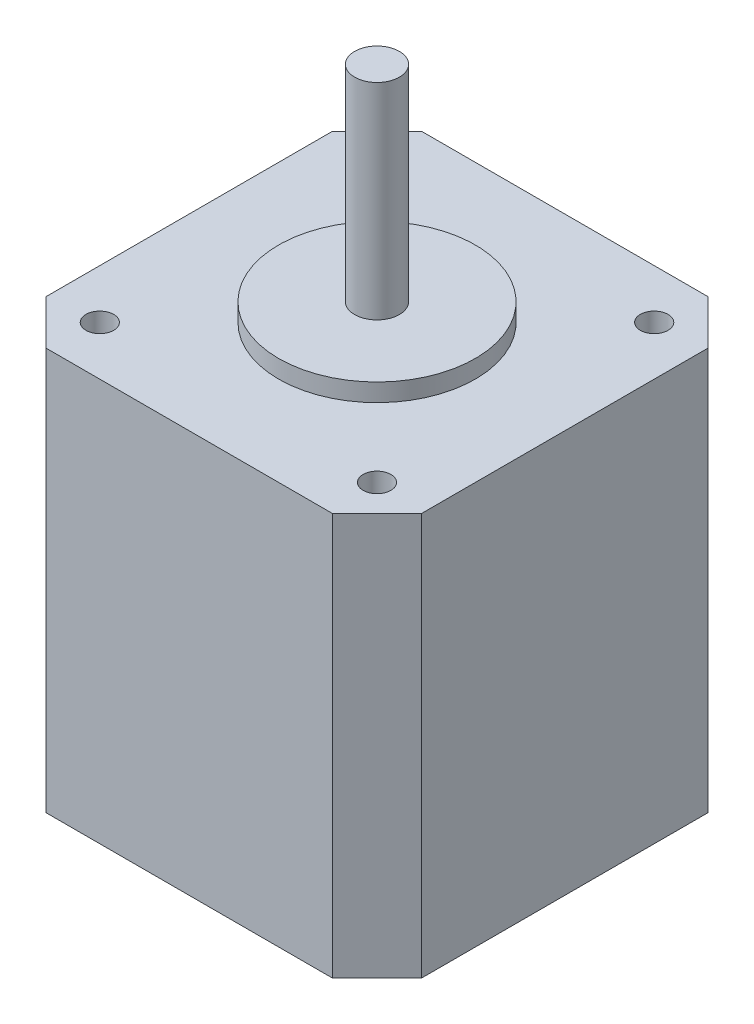
ISO-10303-21;
HEADER;
FILE_DESCRIPTION(('STEP AP214'),'2;1');
FILE_NAME('part.step','',(''),(''),'','','');
FILE_SCHEMA(('AUTOMOTIVE_DESIGN { 1 0 10303 214 1 1 1 1 }'));
ENDSEC;
DATA;
#1=APPLICATION_CONTEXT('core data for automotive mechanical design processes');
#2=APPLICATION_PROTOCOL_DEFINITION('international standard','automotive_design',2000,#1);
#3=PRODUCT_CONTEXT('',#1,'mechanical');
#4=PRODUCT('Part','Part','',(#3));
#5=PRODUCT_RELATED_PRODUCT_CATEGORY('part','',(#4));
#6=PRODUCT_DEFINITION_FORMATION('','',#4);
#7=PRODUCT_DEFINITION_CONTEXT('part definition',#1,'design');
#8=PRODUCT_DEFINITION('design','',#6,#7);
#9=PRODUCT_DEFINITION_SHAPE('','',#8);
#10=(LENGTH_UNIT() NAMED_UNIT(*) SI_UNIT(.MILLI.,.METRE.));
#11=(NAMED_UNIT(*) PLANE_ANGLE_UNIT() SI_UNIT($,.RADIAN.));
#12=(NAMED_UNIT(*) SI_UNIT($,.STERADIAN.) SOLID_ANGLE_UNIT());
#13=UNCERTAINTY_MEASURE_WITH_UNIT(LENGTH_MEASURE(1.E-05),#10,'distance_accuracy_value','');
#14=(GEOMETRIC_REPRESENTATION_CONTEXT(3) GLOBAL_UNCERTAINTY_ASSIGNED_CONTEXT((#13)) GLOBAL_UNIT_ASSIGNED_CONTEXT((#10,
#11,#12)) REPRESENTATION_CONTEXT('',''));
#15=CARTESIAN_POINT('',(0.,0.,0.));
#16=DIRECTION('',(0.,0.,1.));
#17=DIRECTION('',(1.,0.,0.));
#18=AXIS2_PLACEMENT_3D('',#15,#16,#17);
#19=CARTESIAN_POINT('',(-21.,45.,-16.));
#20=DIRECTION('',(1.,0.,0.));
#21=DIRECTION('',(0.,0.,-1.));
#22=AXIS2_PLACEMENT_3D('',#19,#20,#21);
#23=PLANE('',#22);
#24=DIRECTION('',(0.,0.,1.));
#25=VECTOR('',#24,1.);
#26=CARTESIAN_POINT('',(-21.,0.,-16.));
#27=LINE('',#26,#25);
#28=CARTESIAN_POINT('',(-21.,0.,-16.));
#29=VERTEX_POINT('',#28);
#30=CARTESIAN_POINT('',(-21.,0.,16.));
#31=VERTEX_POINT('',#30);
#32=EDGE_CURVE('E135',#29,#31,#27,.T.);
#33=ORIENTED_EDGE('',*,*,#32,.T.);
#34=DIRECTION('',(0.,-1.,0.));
#35=VECTOR('',#34,1.);
#36=CARTESIAN_POINT('',(-21.,45.,16.));
#37=LINE('',#36,#35);
#38=CARTESIAN_POINT('',(-21.,45.,16.));
#39=VERTEX_POINT('',#38);
#40=EDGE_CURVE('E39',#39,#31,#37,.T.);
#41=ORIENTED_EDGE('',*,*,#40,.F.);
#42=DIRECTION('',(0.,0.,1.));
#43=VECTOR('',#42,1.);
#44=CARTESIAN_POINT('',(-21.,45.,-16.));
#45=LINE('',#44,#43);
#46=CARTESIAN_POINT('',(-21.,45.,-16.));
#47=VERTEX_POINT('',#46);
#48=EDGE_CURVE('E150',#47,#39,#45,.T.);
#49=ORIENTED_EDGE('',*,*,#48,.F.);
#50=DIRECTION('',(0.,-1.,0.));
#51=VECTOR('',#50,1.);
#52=CARTESIAN_POINT('',(-21.,45.,-16.));
#53=LINE('',#52,#51);
#54=EDGE_CURVE('E131',#47,#29,#53,.T.);
#55=ORIENTED_EDGE('',*,*,#54,.T.);
#56=EDGE_LOOP('',(#33,#41,#49,#55));
#57=FACE_BOUND('',#56,.T.);
#58=ADVANCED_FACE('F36',(#57),#23,.F.);
#59=CARTESIAN_POINT('',(-21.,45.,16.));
#60=DIRECTION('',(0.707106781186547,0.,-0.707106781186547));
#61=DIRECTION('',(-0.707106781186548,0.,-0.707106781186548));
#62=AXIS2_PLACEMENT_3D('',#59,#60,#61);
#63=PLANE('',#62);
#64=DIRECTION('',(0.707106781186548,0.,0.707106781186548));
#65=VECTOR('',#64,1.);
#66=CARTESIAN_POINT('',(-21.,0.,16.));
#67=LINE('',#66,#65);
#68=CARTESIAN_POINT('',(-16.,0.,21.));
#69=VERTEX_POINT('',#68);
#70=EDGE_CURVE('E138',#31,#69,#67,.T.);
#71=ORIENTED_EDGE('',*,*,#70,.T.);
#72=DIRECTION('',(0.,-1.,0.));
#73=VECTOR('',#72,1.);
#74=CARTESIAN_POINT('',(-16.,45.,21.));
#75=LINE('',#74,#73);
#76=CARTESIAN_POINT('',(-16.,45.,21.));
#77=VERTEX_POINT('',#76);
#78=EDGE_CURVE('E159',#77,#69,#75,.T.);
#79=ORIENTED_EDGE('',*,*,#78,.F.);
#80=DIRECTION('',(0.707106781186548,0.,0.707106781186548));
#81=VECTOR('',#80,1.);
#82=CARTESIAN_POINT('',(-21.,45.,16.));
#83=LINE('',#82,#81);
#84=EDGE_CURVE('E98',#39,#77,#83,.T.);
#85=ORIENTED_EDGE('',*,*,#84,.F.);
#86=ORIENTED_EDGE('',*,*,#40,.T.);
#87=EDGE_LOOP('',(#71,#79,#85,#86));
#88=FACE_BOUND('',#87,.T.);
#89=ADVANCED_FACE('F202',(#88),#63,.F.);
#90=CARTESIAN_POINT('',(-16.,45.,21.));
#91=DIRECTION('',(0.,0.,-1.));
#92=DIRECTION('',(-1.,0.,0.));
#93=AXIS2_PLACEMENT_3D('',#90,#91,#92);
#94=PLANE('',#93);
#95=DIRECTION('',(1.,0.,0.));
#96=VECTOR('',#95,1.);
#97=CARTESIAN_POINT('',(-16.,0.,21.));
#98=LINE('',#97,#96);
#99=CARTESIAN_POINT('',(16.,0.,21.));
#100=VERTEX_POINT('',#99);
#101=EDGE_CURVE('E141',#69,#100,#98,.T.);
#102=ORIENTED_EDGE('',*,*,#101,.T.);
#103=DIRECTION('',(0.,-1.,0.));
#104=VECTOR('',#103,1.);
#105=CARTESIAN_POINT('',(16.,45.,21.));
#106=LINE('',#105,#104);
#107=CARTESIAN_POINT('',(16.,45.,21.));
#108=VERTEX_POINT('',#107);
#109=EDGE_CURVE('E157',#108,#100,#106,.T.);
#110=ORIENTED_EDGE('',*,*,#109,.F.);
#111=DIRECTION('',(1.,0.,0.));
#112=VECTOR('',#111,1.);
#113=CARTESIAN_POINT('',(-16.,45.,21.));
#114=LINE('',#113,#112);
#115=EDGE_CURVE('E173',#77,#108,#114,.T.);
#116=ORIENTED_EDGE('',*,*,#115,.F.);
#117=ORIENTED_EDGE('',*,*,#78,.T.);
#118=EDGE_LOOP('',(#102,#110,#116,#117));
#119=FACE_BOUND('',#118,.T.);
#120=ADVANCED_FACE('F206',(#119),#94,.F.);
#121=CARTESIAN_POINT('',(21.,45.,16.));
#122=DIRECTION('',(-0.707106781186548,0.,-0.707106781186547));
#123=DIRECTION('',(-0.707106781186547,0.,0.707106781186548));
#124=AXIS2_PLACEMENT_3D('',#121,#122,#123);
#125=PLANE('',#124);
#126=DIRECTION('',(0.707106781186547,0.,-0.707106781186548));
#127=VECTOR('',#126,1.);
#128=CARTESIAN_POINT('',(21.,0.,16.));
#129=LINE('',#128,#127);
#130=CARTESIAN_POINT('',(21.,0.,16.));
#131=VERTEX_POINT('',#130);
#132=EDGE_CURVE('E143',#100,#131,#129,.T.);
#133=ORIENTED_EDGE('',*,*,#132,.T.);
#134=DIRECTION('',(0.,-1.,0.));
#135=VECTOR('',#134,1.);
#136=CARTESIAN_POINT('',(21.,45.,16.));
#137=LINE('',#136,#135);
#138=CARTESIAN_POINT('',(21.,45.,16.));
#139=VERTEX_POINT('',#138);
#140=EDGE_CURVE('E154',#139,#131,#137,.T.);
#141=ORIENTED_EDGE('',*,*,#140,.F.);
#142=DIRECTION('',(0.707106781186547,0.,-0.707106781186548));
#143=VECTOR('',#142,1.);
#144=CARTESIAN_POINT('',(21.,45.,16.));
#145=LINE('',#144,#143);
#146=EDGE_CURVE('E175',#108,#139,#145,.T.);
#147=ORIENTED_EDGE('',*,*,#146,.F.);
#148=ORIENTED_EDGE('',*,*,#109,.T.);
#149=EDGE_LOOP('',(#133,#141,#147,#148));
#150=FACE_BOUND('',#149,.T.);
#151=ADVANCED_FACE('F180',(#150),#125,.F.);
#152=CARTESIAN_POINT('',(21.,45.,-16.));
#153=DIRECTION('',(-1.,0.,0.));
#154=DIRECTION('',(0.,0.,1.));
#155=AXIS2_PLACEMENT_3D('',#152,#153,#154);
#156=PLANE('',#155);
#157=DIRECTION('',(0.,0.,-1.));
#158=VECTOR('',#157,1.);
#159=CARTESIAN_POINT('',(21.,0.,-16.));
#160=LINE('',#159,#158);
#161=CARTESIAN_POINT('',(21.,0.,-16.));
#162=VERTEX_POINT('',#161);
#163=EDGE_CURVE('E145',#131,#162,#160,.T.);
#164=ORIENTED_EDGE('',*,*,#163,.T.);
#165=DIRECTION('',(0.,-1.,0.));
#166=VECTOR('',#165,1.);
#167=CARTESIAN_POINT('',(21.,45.,-16.));
#168=LINE('',#167,#166);
#169=CARTESIAN_POINT('',(21.,45.,-16.));
#170=VERTEX_POINT('',#169);
#171=EDGE_CURVE('E126',#170,#162,#168,.T.);
#172=ORIENTED_EDGE('',*,*,#171,.F.);
#173=DIRECTION('',(0.,0.,-1.));
#174=VECTOR('',#173,1.);
#175=CARTESIAN_POINT('',(21.,45.,-16.));
#176=LINE('',#175,#174);
#177=EDGE_CURVE('E117',#139,#170,#176,.T.);
#178=ORIENTED_EDGE('',*,*,#177,.F.);
#179=ORIENTED_EDGE('',*,*,#140,.T.);
#180=EDGE_LOOP('',(#164,#172,#178,#179));
#181=FACE_BOUND('',#180,.T.);
#182=ADVANCED_FACE('F184',(#181),#156,.F.);
#183=CARTESIAN_POINT('',(16.,45.,-21.));
#184=DIRECTION('',(-0.707106781186547,0.,0.707106781186547));
#185=DIRECTION('',(0.707106781186548,0.,0.707106781186548));
#186=AXIS2_PLACEMENT_3D('',#183,#184,#185);
#187=PLANE('',#186);
#188=DIRECTION('',(-0.707106781186548,0.,-0.707106781186548));
#189=VECTOR('',#188,1.);
#190=CARTESIAN_POINT('',(16.,0.,-21.));
#191=LINE('',#190,#189);
#192=CARTESIAN_POINT('',(16.,0.,-21.));
#193=VERTEX_POINT('',#192);
#194=EDGE_CURVE('E125',#162,#193,#191,.T.);
#195=ORIENTED_EDGE('',*,*,#194,.T.);
#196=DIRECTION('',(0.,-1.,0.));
#197=VECTOR('',#196,1.);
#198=CARTESIAN_POINT('',(16.,45.,-21.));
#199=LINE('',#198,#197);
#200=CARTESIAN_POINT('',(16.,45.,-21.));
#201=VERTEX_POINT('',#200);
#202=EDGE_CURVE('E122',#201,#193,#199,.T.);
#203=ORIENTED_EDGE('',*,*,#202,.F.);
#204=DIRECTION('',(-0.707106781186548,0.,-0.707106781186548));
#205=VECTOR('',#204,1.);
#206=CARTESIAN_POINT('',(16.,45.,-21.));
#207=LINE('',#206,#205);
#208=EDGE_CURVE('E111',#170,#201,#207,.T.);
#209=ORIENTED_EDGE('',*,*,#208,.F.);
#210=ORIENTED_EDGE('',*,*,#171,.T.);
#211=EDGE_LOOP('',(#195,#203,#209,#210));
#212=FACE_BOUND('',#211,.T.);
#213=ADVANCED_FACE('F123',(#212),#187,.F.);
#214=CARTESIAN_POINT('',(-16.,45.,-21.));
#215=DIRECTION('',(0.,0.,1.));
#216=DIRECTION('',(1.,0.,0.));
#217=AXIS2_PLACEMENT_3D('',#214,#215,#216);
#218=PLANE('',#217);
#219=DIRECTION('',(-1.,0.,0.));
#220=VECTOR('',#219,1.);
#221=CARTESIAN_POINT('',(-16.,0.,-21.));
#222=LINE('',#221,#220);
#223=CARTESIAN_POINT('',(-16.,0.,-21.));
#224=VERTEX_POINT('',#223);
#225=EDGE_CURVE('E83',#193,#224,#222,.T.);
#226=ORIENTED_EDGE('',*,*,#225,.T.);
#227=DIRECTION('',(0.,-1.,0.));
#228=VECTOR('',#227,1.);
#229=CARTESIAN_POINT('',(-16.,45.,-21.));
#230=LINE('',#229,#228);
#231=CARTESIAN_POINT('',(-16.,45.,-21.));
#232=VERTEX_POINT('',#231);
#233=EDGE_CURVE('E127',#232,#224,#230,.T.);
#234=ORIENTED_EDGE('',*,*,#233,.F.);
#235=DIRECTION('',(-1.,0.,0.));
#236=VECTOR('',#235,1.);
#237=CARTESIAN_POINT('',(-16.,45.,-21.));
#238=LINE('',#237,#236);
#239=EDGE_CURVE('E115',#201,#232,#238,.T.);
#240=ORIENTED_EDGE('',*,*,#239,.F.);
#241=ORIENTED_EDGE('',*,*,#202,.T.);
#242=EDGE_LOOP('',(#226,#234,#240,#241));
#243=FACE_BOUND('',#242,.T.);
#244=ADVANCED_FACE('F129',(#243),#218,.F.);
#245=CARTESIAN_POINT('',(-16.,45.,-21.));
#246=DIRECTION('',(0.707106781186548,0.,0.707106781186547));
#247=DIRECTION('',(0.707106781186547,0.,-0.707106781186548));
#248=AXIS2_PLACEMENT_3D('',#245,#246,#247);
#249=PLANE('',#248);
#250=DIRECTION('',(-0.707106781186547,0.,0.707106781186548));
#251=VECTOR('',#250,1.);
#252=CARTESIAN_POINT('',(-16.,0.,-21.));
#253=LINE('',#252,#251);
#254=EDGE_CURVE('E89',#224,#29,#253,.T.);
#255=ORIENTED_EDGE('',*,*,#254,.T.);
#256=ORIENTED_EDGE('',*,*,#54,.F.);
#257=DIRECTION('',(-0.707106781186547,0.,0.707106781186548));
#258=VECTOR('',#257,1.);
#259=CARTESIAN_POINT('',(-16.,45.,-21.));
#260=LINE('',#259,#258);
#261=EDGE_CURVE('E54',#232,#47,#260,.T.);
#262=ORIENTED_EDGE('',*,*,#261,.F.);
#263=ORIENTED_EDGE('',*,*,#233,.T.);
#264=EDGE_LOOP('',(#255,#256,#262,#263));
#265=FACE_BOUND('',#264,.T.);
#266=ADVANCED_FACE('F190',(#265),#249,.F.);
#267=CARTESIAN_POINT('',(0.,45.,0.));
#268=DIRECTION('',(0.,1.,0.));
#269=DIRECTION('',(0.,0.,1.));
#270=AXIS2_PLACEMENT_3D('',#267,#268,#269);
#271=PLANE('',#270);
#272=CARTESIAN_POINT('',(15.5,45.,-15.5));
#273=DIRECTION('',(0.,1.,0.));
#274=DIRECTION('',(0.,0.,1.));
#275=AXIS2_PLACEMENT_3D('',#272,#273,#274);
#276=CIRCLE('',#275,1.55);
#277=CARTESIAN_POINT('',(15.5,45.,-13.95));
#278=VERTEX_POINT('',#277);
#279=EDGE_CURVE('E370',#278,#278,#276,.T.);
#280=ORIENTED_EDGE('',*,*,#279,.F.);
#281=EDGE_LOOP('',(#280));
#282=FACE_BOUND('',#281,.T.);
#283=CARTESIAN_POINT('',(-15.5,45.,15.5));
#284=DIRECTION('',(0.,1.,0.));
#285=DIRECTION('',(0.,0.,1.));
#286=AXIS2_PLACEMENT_3D('',#283,#284,#285);
#287=CIRCLE('',#286,1.55);
#288=CARTESIAN_POINT('',(-15.5,45.,17.05));
#289=VERTEX_POINT('',#288);
#290=EDGE_CURVE('E384',#289,#289,#287,.T.);
#291=ORIENTED_EDGE('',*,*,#290,.F.);
#292=EDGE_LOOP('',(#291));
#293=FACE_BOUND('',#292,.T.);
#294=CARTESIAN_POINT('',(15.5,45.,15.5));
#295=DIRECTION('',(0.,1.,0.));
#296=DIRECTION('',(0.,0.,1.));
#297=AXIS2_PLACEMENT_3D('',#294,#295,#296);
#298=CIRCLE('',#297,1.55);
#299=CARTESIAN_POINT('',(15.5,45.,17.05));
#300=VERTEX_POINT('',#299);
#301=EDGE_CURVE('E379',#300,#300,#298,.T.);
#302=ORIENTED_EDGE('',*,*,#301,.F.);
#303=EDGE_LOOP('',(#302));
#304=FACE_BOUND('',#303,.T.);
#305=CARTESIAN_POINT('',(-15.5,45.,-15.5));
#306=DIRECTION('',(0.,1.,0.));
#307=DIRECTION('',(0.,0.,1.));
#308=AXIS2_PLACEMENT_3D('',#305,#306,#307);
#309=CIRCLE('',#308,1.55);
#310=CARTESIAN_POINT('',(-15.5,45.,-13.95));
#311=VERTEX_POINT('',#310);
#312=EDGE_CURVE('E369',#311,#311,#309,.T.);
#313=ORIENTED_EDGE('',*,*,#312,.F.);
#314=EDGE_LOOP('',(#313));
#315=FACE_BOUND('',#314,.T.);
#316=CARTESIAN_POINT('',(0.,45.,0.));
#317=DIRECTION('',(0.,1.,0.));
#318=DIRECTION('',(0.,0.,1.));
#319=AXIS2_PLACEMENT_3D('',#316,#317,#318);
#320=CIRCLE('',#319,11.);
#321=CARTESIAN_POINT('',(0.,45.,11.));
#322=VERTEX_POINT('',#321);
#323=EDGE_CURVE('E45',#322,#322,#320,.T.);
#324=ORIENTED_EDGE('',*,*,#323,.F.);
#325=EDGE_LOOP('',(#324));
#326=FACE_BOUND('',#325,.T.);
#327=ORIENTED_EDGE('',*,*,#48,.T.);
#328=ORIENTED_EDGE('',*,*,#84,.T.);
#329=ORIENTED_EDGE('',*,*,#115,.T.);
#330=ORIENTED_EDGE('',*,*,#146,.T.);
#331=ORIENTED_EDGE('',*,*,#177,.T.);
#332=ORIENTED_EDGE('',*,*,#208,.T.);
#333=ORIENTED_EDGE('',*,*,#239,.T.);
#334=ORIENTED_EDGE('',*,*,#261,.T.);
#335=EDGE_LOOP('',(#327,#328,#329,#330,#331,#332,#333,#334));
#336=FACE_BOUND('',#335,.T.);
#337=ADVANCED_FACE('F113',(#282,#293,#304,#315,#326,#336),#271,.T.);
#338=CARTESIAN_POINT('',(0.,0.,0.));
#339=DIRECTION('',(0.,1.,0.));
#340=DIRECTION('',(0.,0.,1.));
#341=AXIS2_PLACEMENT_3D('',#338,#339,#340);
#342=PLANE('',#341);
#343=ORIENTED_EDGE('',*,*,#32,.F.);
#344=ORIENTED_EDGE('',*,*,#254,.F.);
#345=ORIENTED_EDGE('',*,*,#225,.F.);
#346=ORIENTED_EDGE('',*,*,#194,.F.);
#347=ORIENTED_EDGE('',*,*,#163,.F.);
#348=ORIENTED_EDGE('',*,*,#132,.F.);
#349=ORIENTED_EDGE('',*,*,#101,.F.);
#350=ORIENTED_EDGE('',*,*,#70,.F.);
#351=EDGE_LOOP('',(#343,#344,#345,#346,#347,#348,#349,#350));
#352=FACE_BOUND('',#351,.T.);
#353=ADVANCED_FACE('F187',(#352),#342,.F.);
#354=CARTESIAN_POINT('',(0.,47.,0.));
#355=DIRECTION('',(0.,-1.,0.));
#356=DIRECTION('',(0.,0.,-1.));
#357=AXIS2_PLACEMENT_3D('',#354,#355,#356);
#358=CYLINDRICAL_SURFACE('',#357,11.);
#359=CARTESIAN_POINT('',(0.,47.,0.));
#360=DIRECTION('',(0.,1.,0.));
#361=DIRECTION('',(0.,0.,1.));
#362=AXIS2_PLACEMENT_3D('',#359,#360,#361);
#363=CIRCLE('',#362,11.);
#364=CARTESIAN_POINT('',(0.,47.,11.));
#365=VERTEX_POINT('',#364);
#366=EDGE_CURVE('E139',#365,#365,#363,.T.);
#367=ORIENTED_EDGE('',*,*,#366,.F.);
#368=EDGE_LOOP('',(#367));
#369=FACE_BOUND('',#368,.T.);
#370=ORIENTED_EDGE('',*,*,#323,.T.);
#371=EDGE_LOOP('',(#370));
#372=FACE_BOUND('',#371,.T.);
#373=ADVANCED_FACE('F239',(#369,#372),#358,.T.);
#374=CARTESIAN_POINT('',(0.,47.,0.));
#375=DIRECTION('',(0.,1.,0.));
#376=DIRECTION('',(0.,0.,1.));
#377=AXIS2_PLACEMENT_3D('',#374,#375,#376);
#378=PLANE('',#377);
#379=CARTESIAN_POINT('',(0.,47.,0.));
#380=DIRECTION('',(0.,1.,0.));
#381=DIRECTION('',(0.,0.,1.));
#382=AXIS2_PLACEMENT_3D('',#379,#380,#381);
#383=CIRCLE('',#382,2.5);
#384=CARTESIAN_POINT('',(0.,47.,2.5));
#385=VERTEX_POINT('',#384);
#386=EDGE_CURVE('E11',#385,#385,#383,.T.);
#387=ORIENTED_EDGE('',*,*,#386,.F.);
#388=EDGE_LOOP('',(#387));
#389=FACE_BOUND('',#388,.T.);
#390=ORIENTED_EDGE('',*,*,#366,.T.);
#391=EDGE_LOOP('',(#390));
#392=FACE_BOUND('',#391,.T.);
#393=ADVANCED_FACE('F247',(#389,#392),#378,.T.);
#394=CARTESIAN_POINT('',(0.,70.,0.));
#395=DIRECTION('',(0.,-1.,0.));
#396=DIRECTION('',(0.,0.,-1.));
#397=AXIS2_PLACEMENT_3D('',#394,#395,#396);
#398=CYLINDRICAL_SURFACE('',#397,2.5);
#399=CARTESIAN_POINT('',(0.,70.,0.));
#400=DIRECTION('',(0.,1.,0.));
#401=DIRECTION('',(0.,0.,1.));
#402=AXIS2_PLACEMENT_3D('',#399,#400,#401);
#403=CIRCLE('',#402,2.5);
#404=CARTESIAN_POINT('',(0.,70.,2.5));
#405=VERTEX_POINT('',#404);
#406=EDGE_CURVE('E389',#405,#405,#403,.T.);
#407=ORIENTED_EDGE('',*,*,#406,.F.);
#408=EDGE_LOOP('',(#407));
#409=FACE_BOUND('',#408,.T.);
#410=ORIENTED_EDGE('',*,*,#386,.T.);
#411=EDGE_LOOP('',(#410));
#412=FACE_BOUND('',#411,.T.);
#413=ADVANCED_FACE('F257',(#409,#412),#398,.T.);
#414=CARTESIAN_POINT('',(0.,70.,0.));
#415=DIRECTION('',(0.,1.,0.));
#416=DIRECTION('',(0.,0.,1.));
#417=AXIS2_PLACEMENT_3D('',#414,#415,#416);
#418=PLANE('',#417);
#419=ORIENTED_EDGE('',*,*,#406,.T.);
#420=EDGE_LOOP('',(#419));
#421=FACE_BOUND('',#420,.T.);
#422=ADVANCED_FACE('F267',(#421),#418,.T.);
#423=CARTESIAN_POINT('',(-15.5,40.,-15.5));
#424=DIRECTION('',(0.,1.,0.));
#425=DIRECTION('',(0.,0.,1.));
#426=AXIS2_PLACEMENT_3D('',#423,#424,#425);
#427=CYLINDRICAL_SURFACE('',#426,1.55);
#428=CARTESIAN_POINT('',(-15.5,40.,-15.5));
#429=DIRECTION('',(0.,1.,0.));
#430=DIRECTION('',(0.,0.,1.));
#431=AXIS2_PLACEMENT_3D('',#428,#429,#430);
#432=CIRCLE('',#431,1.55);
#433=CARTESIAN_POINT('',(-15.5,40.,-13.95));
#434=VERTEX_POINT('',#433);
#435=EDGE_CURVE('E373',#434,#434,#432,.T.);
#436=ORIENTED_EDGE('',*,*,#435,.F.);
#437=EDGE_LOOP('',(#436));
#438=FACE_BOUND('',#437,.T.);
#439=ORIENTED_EDGE('',*,*,#312,.T.);
#440=EDGE_LOOP('',(#439));
#441=FACE_BOUND('',#440,.T.);
#442=ADVANCED_FACE('F277',(#438,#441),#427,.F.);
#443=CARTESIAN_POINT('',(-15.5,40.,-15.5));
#444=DIRECTION('',(0.,1.,0.));
#445=DIRECTION('',(0.,0.,1.));
#446=AXIS2_PLACEMENT_3D('',#443,#444,#445);
#447=PLANE('',#446);
#448=ORIENTED_EDGE('',*,*,#435,.T.);
#449=EDGE_LOOP('',(#448));
#450=FACE_BOUND('',#449,.T.);
#451=ADVANCED_FACE('F292',(#450),#447,.T.);
#452=CARTESIAN_POINT('',(15.5,40.,15.5));
#453=DIRECTION('',(0.,1.,0.));
#454=DIRECTION('',(0.,0.,1.));
#455=AXIS2_PLACEMENT_3D('',#452,#453,#454);
#456=CYLINDRICAL_SURFACE('',#455,1.55);
#457=CARTESIAN_POINT('',(15.5,40.,15.5));
#458=DIRECTION('',(0.,1.,0.));
#459=DIRECTION('',(0.,0.,1.));
#460=AXIS2_PLACEMENT_3D('',#457,#458,#459);
#461=CIRCLE('',#460,1.55);
#462=CARTESIAN_POINT('',(15.5,40.,17.05));
#463=VERTEX_POINT('',#462);
#464=EDGE_CURVE('E387',#463,#463,#461,.T.);
#465=ORIENTED_EDGE('',*,*,#464,.F.);
#466=EDGE_LOOP('',(#465));
#467=FACE_BOUND('',#466,.T.);
#468=ORIENTED_EDGE('',*,*,#301,.T.);
#469=EDGE_LOOP('',(#468));
#470=FACE_BOUND('',#469,.T.);
#471=ADVANCED_FACE('F302',(#467,#470),#456,.F.);
#472=CARTESIAN_POINT('',(15.5,40.,15.5));
#473=DIRECTION('',(0.,1.,0.));
#474=DIRECTION('',(0.,0.,1.));
#475=AXIS2_PLACEMENT_3D('',#472,#473,#474);
#476=PLANE('',#475);
#477=ORIENTED_EDGE('',*,*,#464,.T.);
#478=EDGE_LOOP('',(#477));
#479=FACE_BOUND('',#478,.T.);
#480=ADVANCED_FACE('F312',(#479),#476,.T.);
#481=CARTESIAN_POINT('',(-15.5,40.,15.5));
#482=DIRECTION('',(0.,1.,0.));
#483=DIRECTION('',(0.,0.,1.));
#484=AXIS2_PLACEMENT_3D('',#481,#482,#483);
#485=CYLINDRICAL_SURFACE('',#484,1.55);
#486=CARTESIAN_POINT('',(-15.5,40.,15.5));
#487=DIRECTION('',(0.,1.,0.));
#488=DIRECTION('',(0.,0.,1.));
#489=AXIS2_PLACEMENT_3D('',#486,#487,#488);
#490=CIRCLE('',#489,1.55);
#491=CARTESIAN_POINT('',(-15.5,40.,17.05));
#492=VERTEX_POINT('',#491);
#493=EDGE_CURVE('E376',#492,#492,#490,.T.);
#494=ORIENTED_EDGE('',*,*,#493,.F.);
#495=EDGE_LOOP('',(#494));
#496=FACE_BOUND('',#495,.T.);
#497=ORIENTED_EDGE('',*,*,#290,.T.);
#498=EDGE_LOOP('',(#497));
#499=FACE_BOUND('',#498,.T.);
#500=ADVANCED_FACE('F322',(#496,#499),#485,.F.);
#501=CARTESIAN_POINT('',(-15.5,40.,15.5));
#502=DIRECTION('',(0.,1.,0.));
#503=DIRECTION('',(0.,0.,1.));
#504=AXIS2_PLACEMENT_3D('',#501,#502,#503);
#505=PLANE('',#504);
#506=ORIENTED_EDGE('',*,*,#493,.T.);
#507=EDGE_LOOP('',(#506));
#508=FACE_BOUND('',#507,.T.);
#509=ADVANCED_FACE('F332',(#508),#505,.T.);
#510=CARTESIAN_POINT('',(15.5,40.,-15.5));
#511=DIRECTION('',(0.,1.,0.));
#512=DIRECTION('',(0.,0.,1.));
#513=AXIS2_PLACEMENT_3D('',#510,#511,#512);
#514=CYLINDRICAL_SURFACE('',#513,1.55);
#515=CARTESIAN_POINT('',(15.5,40.,-15.5));
#516=DIRECTION('',(0.,1.,0.));
#517=DIRECTION('',(0.,0.,1.));
#518=AXIS2_PLACEMENT_3D('',#515,#516,#517);
#519=CIRCLE('',#518,1.55);
#520=CARTESIAN_POINT('',(15.5,40.,-13.95));
#521=VERTEX_POINT('',#520);
#522=EDGE_CURVE('E368',#521,#521,#519,.T.);
#523=ORIENTED_EDGE('',*,*,#522,.F.);
#524=EDGE_LOOP('',(#523));
#525=FACE_BOUND('',#524,.T.);
#526=ORIENTED_EDGE('',*,*,#279,.T.);
#527=EDGE_LOOP('',(#526));
#528=FACE_BOUND('',#527,.T.);
#529=ADVANCED_FACE('F342',(#525,#528),#514,.F.);
#530=CARTESIAN_POINT('',(15.5,40.,-15.5));
#531=DIRECTION('',(0.,1.,0.));
#532=DIRECTION('',(0.,0.,1.));
#533=AXIS2_PLACEMENT_3D('',#530,#531,#532);
#534=PLANE('',#533);
#535=ORIENTED_EDGE('',*,*,#522,.T.);
#536=EDGE_LOOP('',(#535));
#537=FACE_BOUND('',#536,.T.);
#538=ADVANCED_FACE('F352',(#537),#534,.T.);
#539=CLOSED_SHELL('',(#58,#89,#120,#151,#182,#213,#244,#266,#337,#353,#373,#393,#413,#422,#442,
#451,#471,#480,#500,#509,#529,#538));
#540=MANIFOLD_SOLID_BREP('B2',#539);
#541=ADVANCED_BREP_SHAPE_REPRESENTATION('',(#18,#540),#14);
#542=SHAPE_DEFINITION_REPRESENTATION(#9,#541);
ENDSEC;
END-ISO-10303-21;
